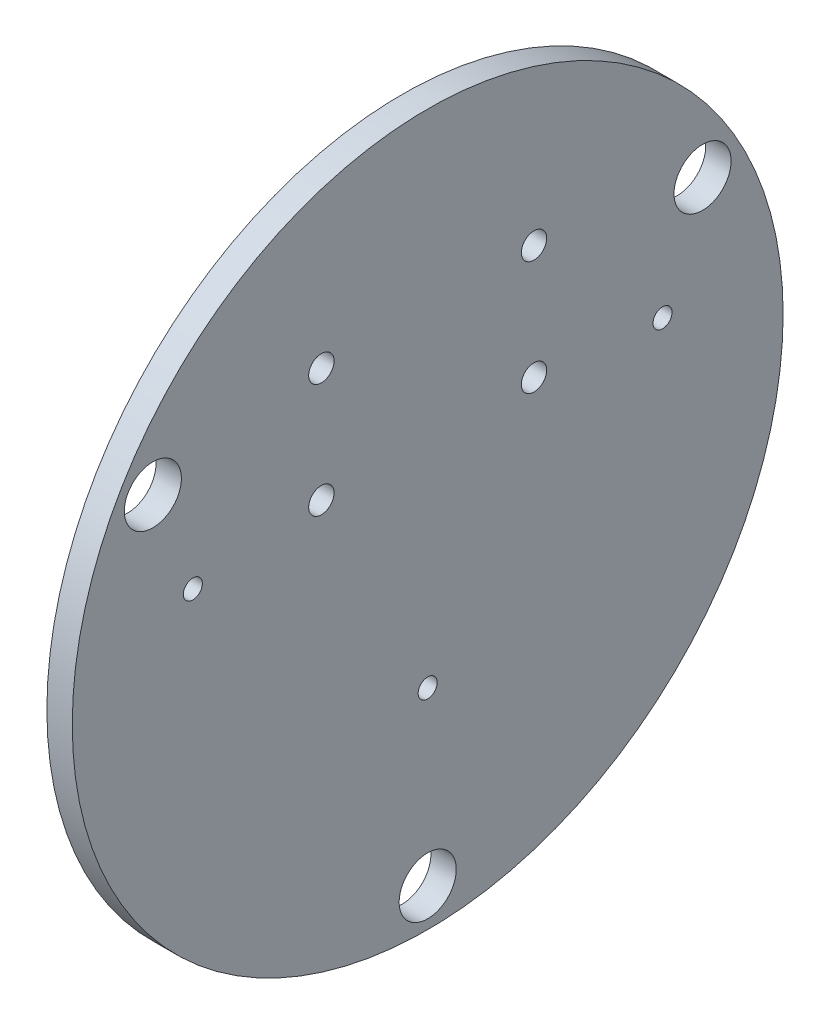
ISO-10303-21;
HEADER;
FILE_DESCRIPTION(('STEP AP214'),'2;1');
FILE_NAME('part.step','',(''),(''),'','','');
FILE_SCHEMA(('AUTOMOTIVE_DESIGN { 1 0 10303 214 1 1 1 1 }'));
ENDSEC;
DATA;
#1=APPLICATION_CONTEXT('core data for automotive mechanical design processes');
#2=APPLICATION_PROTOCOL_DEFINITION('international standard','automotive_design',2000,#1);
#3=PRODUCT_CONTEXT('',#1,'mechanical');
#4=PRODUCT('Part','Part','',(#3));
#5=PRODUCT_RELATED_PRODUCT_CATEGORY('part','',(#4));
#6=PRODUCT_DEFINITION_FORMATION('','',#4);
#7=PRODUCT_DEFINITION_CONTEXT('part definition',#1,'design');
#8=PRODUCT_DEFINITION('design','',#6,#7);
#9=PRODUCT_DEFINITION_SHAPE('','',#8);
#10=(LENGTH_UNIT() NAMED_UNIT(*) SI_UNIT(.MILLI.,.METRE.));
#11=(NAMED_UNIT(*) PLANE_ANGLE_UNIT() SI_UNIT($,.RADIAN.));
#12=(NAMED_UNIT(*) SI_UNIT($,.STERADIAN.) SOLID_ANGLE_UNIT());
#13=UNCERTAINTY_MEASURE_WITH_UNIT(LENGTH_MEASURE(1.E-05),#10,'distance_accuracy_value','');
#14=(GEOMETRIC_REPRESENTATION_CONTEXT(3) GLOBAL_UNCERTAINTY_ASSIGNED_CONTEXT((#13)) GLOBAL_UNIT_ASSIGNED_CONTEXT((#10,
#11,#12)) REPRESENTATION_CONTEXT('',''));
#15=CARTESIAN_POINT('',(0.,0.,0.));
#16=DIRECTION('',(0.,0.,1.));
#17=DIRECTION('',(1.,0.,0.));
#18=AXIS2_PLACEMENT_3D('',#15,#16,#17);
#19=CARTESIAN_POINT('',(4.,0.,0.));
#20=DIRECTION('',(-1.,0.,0.));
#21=DIRECTION('',(0.,0.,1.));
#22=AXIS2_PLACEMENT_3D('',#19,#20,#21);
#23=CYLINDRICAL_SURFACE('',#22,56.);
#24=CARTESIAN_POINT('',(4.,0.,0.));
#25=DIRECTION('',(1.,0.,0.));
#26=DIRECTION('',(0.,0.,-1.));
#27=AXIS2_PLACEMENT_3D('',#24,#25,#26);
#28=CIRCLE('',#27,56.);
#29=CARTESIAN_POINT('',(4.,0.,-56.));
#30=VERTEX_POINT('',#29);
#31=EDGE_CURVE('E10',#30,#30,#28,.T.);
#32=ORIENTED_EDGE('',*,*,#31,.F.);
#33=EDGE_LOOP('',(#32));
#34=FACE_BOUND('',#33,.T.);
#35=CARTESIAN_POINT('',(0.,0.,0.));
#36=DIRECTION('',(1.,0.,0.));
#37=DIRECTION('',(0.,0.,-1.));
#38=AXIS2_PLACEMENT_3D('',#35,#36,#37);
#39=CIRCLE('',#38,56.);
#40=CARTESIAN_POINT('',(0.,0.,-56.));
#41=VERTEX_POINT('',#40);
#42=EDGE_CURVE('E33',#41,#41,#39,.T.);
#43=ORIENTED_EDGE('',*,*,#42,.T.);
#44=EDGE_LOOP('',(#43));
#45=FACE_BOUND('',#44,.T.);
#46=ADVANCED_FACE('F30',(#34,#45),#23,.T.);
#47=CARTESIAN_POINT('',(4.,0.,0.));
#48=DIRECTION('',(1.,0.,0.));
#49=DIRECTION('',(0.,0.,-1.));
#50=AXIS2_PLACEMENT_3D('',#47,#48,#49);
#51=PLANE('',#50);
#52=CARTESIAN_POINT('',(4.,9.,-37.));
#53=DIRECTION('',(1.,0.,0.));
#54=DIRECTION('',(0.,0.,-1.));
#55=AXIS2_PLACEMENT_3D('',#52,#53,#54);
#56=CIRCLE('',#55,1.5);
#57=CARTESIAN_POINT('',(4.,9.,-38.5));
#58=VERTEX_POINT('',#57);
#59=EDGE_CURVE('E84',#58,#58,#56,.T.);
#60=ORIENTED_EDGE('',*,*,#59,.F.);
#61=EDGE_LOOP('',(#60));
#62=FACE_BOUND('',#61,.T.);
#63=CARTESIAN_POINT('',(4.,-23.,0.));
#64=DIRECTION('',(1.,0.,0.));
#65=DIRECTION('',(0.,0.,-1.));
#66=AXIS2_PLACEMENT_3D('',#63,#64,#65);
#67=CIRCLE('',#66,1.5);
#68=CARTESIAN_POINT('',(4.,-23.,-1.50000000000001));
#69=VERTEX_POINT('',#68);
#70=EDGE_CURVE('E90',#69,#69,#67,.T.);
#71=ORIENTED_EDGE('',*,*,#70,.F.);
#72=EDGE_LOOP('',(#71));
#73=FACE_BOUND('',#72,.T.);
#74=CARTESIAN_POINT('',(4.,9.,37.));
#75=DIRECTION('',(1.,0.,0.));
#76=DIRECTION('',(0.,0.,-1.));
#77=AXIS2_PLACEMENT_3D('',#74,#75,#76);
#78=CIRCLE('',#77,1.50000000000002);
#79=CARTESIAN_POINT('',(4.,9.,35.5));
#80=VERTEX_POINT('',#79);
#81=EDGE_CURVE('E96',#80,#80,#78,.T.);
#82=ORIENTED_EDGE('',*,*,#81,.F.);
#83=EDGE_LOOP('',(#82));
#84=FACE_BOUND('',#83,.T.);
#85=CARTESIAN_POINT('',(4.,11.,16.75));
#86=DIRECTION('',(1.,0.,0.));
#87=DIRECTION('',(0.,0.,-1.));
#88=AXIS2_PLACEMENT_3D('',#85,#86,#87);
#89=CIRCLE('',#88,2.);
#90=CARTESIAN_POINT('',(4.,11.,14.75));
#91=VERTEX_POINT('',#90);
#92=EDGE_CURVE('E66',#91,#91,#89,.T.);
#93=ORIENTED_EDGE('',*,*,#92,.F.);
#94=EDGE_LOOP('',(#93));
#95=FACE_BOUND('',#94,.T.);
#96=CARTESIAN_POINT('',(4.,11.,-16.75));
#97=DIRECTION('',(1.,0.,0.));
#98=DIRECTION('',(0.,0.,-1.));
#99=AXIS2_PLACEMENT_3D('',#96,#97,#98);
#100=CIRCLE('',#99,2.);
#101=CARTESIAN_POINT('',(4.,11.,-18.75));
#102=VERTEX_POINT('',#101);
#103=EDGE_CURVE('E73',#102,#102,#100,.T.);
#104=ORIENTED_EDGE('',*,*,#103,.F.);
#105=EDGE_LOOP('',(#104));
#106=FACE_BOUND('',#105,.T.);
#107=CARTESIAN_POINT('',(4.,28.9954942187123,-16.75));
#108=DIRECTION('',(1.,0.,0.));
#109=DIRECTION('',(0.,0.,-1.));
#110=AXIS2_PLACEMENT_3D('',#107,#108,#109);
#111=CIRCLE('',#110,2.);
#112=CARTESIAN_POINT('',(4.,28.9954942187123,-18.75));
#113=VERTEX_POINT('',#112);
#114=EDGE_CURVE('E79',#113,#113,#111,.T.);
#115=ORIENTED_EDGE('',*,*,#114,.F.);
#116=EDGE_LOOP('',(#115));
#117=FACE_BOUND('',#116,.T.);
#118=CARTESIAN_POINT('',(4.,28.9954942187123,16.75));
#119=DIRECTION('',(1.,0.,0.));
#120=DIRECTION('',(0.,0.,-1.));
#121=AXIS2_PLACEMENT_3D('',#118,#119,#120);
#122=CIRCLE('',#121,2.);
#123=CARTESIAN_POINT('',(4.,28.9954942187123,14.75));
#124=VERTEX_POINT('',#123);
#125=EDGE_CURVE('E60',#124,#124,#122,.T.);
#126=ORIENTED_EDGE('',*,*,#125,.F.);
#127=EDGE_LOOP('',(#126));
#128=FACE_BOUND('',#127,.T.);
#129=CARTESIAN_POINT('',(4.,25.,43.3012701892219));
#130=DIRECTION('',(-1.,0.,0.));
#131=DIRECTION('',(0.,0.,1.));
#132=AXIS2_PLACEMENT_3D('',#129,#130,#131);
#133=CIRCLE('',#132,4.5);
#134=CARTESIAN_POINT('',(4.,25.,47.8012701892219));
#135=VERTEX_POINT('',#134);
#136=EDGE_CURVE('E45',#135,#135,#133,.T.);
#137=ORIENTED_EDGE('',*,*,#136,.T.);
#138=EDGE_LOOP('',(#137));
#139=FACE_BOUND('',#138,.T.);
#140=CARTESIAN_POINT('',(4.,-50.,0.));
#141=DIRECTION('',(-1.,0.,0.));
#142=DIRECTION('',(0.,0.,1.));
#143=AXIS2_PLACEMENT_3D('',#140,#141,#142);
#144=CIRCLE('',#143,4.5);
#145=CARTESIAN_POINT('',(4.,-50.,4.5));
#146=VERTEX_POINT('',#145);
#147=EDGE_CURVE('E51',#146,#146,#144,.T.);
#148=ORIENTED_EDGE('',*,*,#147,.T.);
#149=EDGE_LOOP('',(#148));
#150=FACE_BOUND('',#149,.T.);
#151=CARTESIAN_POINT('',(4.,25.,-43.3012701892219));
#152=DIRECTION('',(-1.,0.,0.));
#153=DIRECTION('',(0.,0.,1.));
#154=AXIS2_PLACEMENT_3D('',#151,#152,#153);
#155=CIRCLE('',#154,4.5);
#156=CARTESIAN_POINT('',(4.,25.,-38.8012701892219));
#157=VERTEX_POINT('',#156);
#158=EDGE_CURVE('E40',#157,#157,#155,.T.);
#159=ORIENTED_EDGE('',*,*,#158,.T.);
#160=EDGE_LOOP('',(#159));
#161=FACE_BOUND('',#160,.T.);
#162=ORIENTED_EDGE('',*,*,#31,.T.);
#163=EDGE_LOOP('',(#162));
#164=FACE_BOUND('',#163,.T.);
#165=ADVANCED_FACE('F113',(#62,#73,#84,#95,#106,#117,#128,#139,#150,#161,#164),#51,.T.);
#166=CARTESIAN_POINT('',(0.,0.,0.));
#167=DIRECTION('',(1.,0.,0.));
#168=DIRECTION('',(0.,0.,-1.));
#169=AXIS2_PLACEMENT_3D('',#166,#167,#168);
#170=PLANE('',#169);
#171=CARTESIAN_POINT('',(0.,9.,-37.));
#172=DIRECTION('',(1.,0.,0.));
#173=DIRECTION('',(0.,0.,-1.));
#174=AXIS2_PLACEMENT_3D('',#171,#172,#173);
#175=CIRCLE('',#174,1.5);
#176=CARTESIAN_POINT('',(0.,9.,-38.5));
#177=VERTEX_POINT('',#176);
#178=EDGE_CURVE('E87',#177,#177,#175,.T.);
#179=ORIENTED_EDGE('',*,*,#178,.T.);
#180=EDGE_LOOP('',(#179));
#181=FACE_BOUND('',#180,.T.);
#182=CARTESIAN_POINT('',(0.,-23.,0.));
#183=DIRECTION('',(1.,0.,0.));
#184=DIRECTION('',(0.,0.,-1.));
#185=AXIS2_PLACEMENT_3D('',#182,#183,#184);
#186=CIRCLE('',#185,1.5);
#187=CARTESIAN_POINT('',(0.,-23.,-1.50000000000001));
#188=VERTEX_POINT('',#187);
#189=EDGE_CURVE('E93',#188,#188,#186,.T.);
#190=ORIENTED_EDGE('',*,*,#189,.T.);
#191=EDGE_LOOP('',(#190));
#192=FACE_BOUND('',#191,.T.);
#193=CARTESIAN_POINT('',(0.,9.,37.));
#194=DIRECTION('',(1.,0.,0.));
#195=DIRECTION('',(0.,0.,-1.));
#196=AXIS2_PLACEMENT_3D('',#193,#194,#195);
#197=CIRCLE('',#196,1.50000000000002);
#198=CARTESIAN_POINT('',(0.,9.,35.5));
#199=VERTEX_POINT('',#198);
#200=EDGE_CURVE('E70',#199,#199,#197,.T.);
#201=ORIENTED_EDGE('',*,*,#200,.T.);
#202=EDGE_LOOP('',(#201));
#203=FACE_BOUND('',#202,.T.);
#204=CARTESIAN_POINT('',(0.,11.,16.75));
#205=DIRECTION('',(1.,0.,0.));
#206=DIRECTION('',(0.,0.,-1.));
#207=AXIS2_PLACEMENT_3D('',#204,#205,#206);
#208=CIRCLE('',#207,2.);
#209=CARTESIAN_POINT('',(0.,11.,14.75));
#210=VERTEX_POINT('',#209);
#211=EDGE_CURVE('E69',#210,#210,#208,.T.);
#212=ORIENTED_EDGE('',*,*,#211,.T.);
#213=EDGE_LOOP('',(#212));
#214=FACE_BOUND('',#213,.T.);
#215=CARTESIAN_POINT('',(0.,11.,-16.75));
#216=DIRECTION('',(1.,0.,0.));
#217=DIRECTION('',(0.,0.,-1.));
#218=AXIS2_PLACEMENT_3D('',#215,#216,#217);
#219=CIRCLE('',#218,2.);
#220=CARTESIAN_POINT('',(0.,11.,-18.75));
#221=VERTEX_POINT('',#220);
#222=EDGE_CURVE('E76',#221,#221,#219,.T.);
#223=ORIENTED_EDGE('',*,*,#222,.T.);
#224=EDGE_LOOP('',(#223));
#225=FACE_BOUND('',#224,.T.);
#226=CARTESIAN_POINT('',(0.,28.9954942187123,-16.75));
#227=DIRECTION('',(1.,0.,0.));
#228=DIRECTION('',(0.,0.,-1.));
#229=AXIS2_PLACEMENT_3D('',#226,#227,#228);
#230=CIRCLE('',#229,2.);
#231=CARTESIAN_POINT('',(0.,28.9954942187123,-18.75));
#232=VERTEX_POINT('',#231);
#233=EDGE_CURVE('E63',#232,#232,#230,.T.);
#234=ORIENTED_EDGE('',*,*,#233,.T.);
#235=EDGE_LOOP('',(#234));
#236=FACE_BOUND('',#235,.T.);
#237=CARTESIAN_POINT('',(0.,28.9954942187123,16.75));
#238=DIRECTION('',(1.,0.,0.));
#239=DIRECTION('',(0.,0.,-1.));
#240=AXIS2_PLACEMENT_3D('',#237,#238,#239);
#241=CIRCLE('',#240,2.);
#242=CARTESIAN_POINT('',(0.,28.9954942187123,14.75));
#243=VERTEX_POINT('',#242);
#244=EDGE_CURVE('E52',#243,#243,#241,.T.);
#245=ORIENTED_EDGE('',*,*,#244,.T.);
#246=EDGE_LOOP('',(#245));
#247=FACE_BOUND('',#246,.T.);
#248=CARTESIAN_POINT('',(0.,25.,43.3012701892219));
#249=DIRECTION('',(-1.,0.,0.));
#250=DIRECTION('',(0.,0.,1.));
#251=AXIS2_PLACEMENT_3D('',#248,#249,#250);
#252=CIRCLE('',#251,4.5);
#253=CARTESIAN_POINT('',(0.,25.,47.8012701892219));
#254=VERTEX_POINT('',#253);
#255=EDGE_CURVE('E55',#254,#254,#252,.T.);
#256=ORIENTED_EDGE('',*,*,#255,.F.);
#257=EDGE_LOOP('',(#256));
#258=FACE_BOUND('',#257,.T.);
#259=CARTESIAN_POINT('',(0.,-50.,0.));
#260=DIRECTION('',(-1.,0.,0.));
#261=DIRECTION('',(0.,0.,1.));
#262=AXIS2_PLACEMENT_3D('',#259,#260,#261);
#263=CIRCLE('',#262,4.5);
#264=CARTESIAN_POINT('',(0.,-50.,4.5));
#265=VERTEX_POINT('',#264);
#266=EDGE_CURVE('E48',#265,#265,#263,.T.);
#267=ORIENTED_EDGE('',*,*,#266,.F.);
#268=EDGE_LOOP('',(#267));
#269=FACE_BOUND('',#268,.T.);
#270=CARTESIAN_POINT('',(0.,25.,-43.3012701892219));
#271=DIRECTION('',(-1.,0.,0.));
#272=DIRECTION('',(0.,0.,1.));
#273=AXIS2_PLACEMENT_3D('',#270,#271,#272);
#274=CIRCLE('',#273,4.5);
#275=CARTESIAN_POINT('',(0.,25.,-38.8012701892219));
#276=VERTEX_POINT('',#275);
#277=EDGE_CURVE('E42',#276,#276,#274,.T.);
#278=ORIENTED_EDGE('',*,*,#277,.F.);
#279=EDGE_LOOP('',(#278));
#280=FACE_BOUND('',#279,.T.);
#281=ORIENTED_EDGE('',*,*,#42,.F.);
#282=EDGE_LOOP('',(#281));
#283=FACE_BOUND('',#282,.T.);
#284=ADVANCED_FACE('F102',(#181,#192,#203,#214,#225,#236,#247,#258,#269,#280,#283),#170,.F.);
#285=CARTESIAN_POINT('',(4.,25.,-43.3012701892219));
#286=DIRECTION('',(-1.,0.,0.));
#287=DIRECTION('',(0.,0.,1.));
#288=AXIS2_PLACEMENT_3D('',#285,#286,#287);
#289=CYLINDRICAL_SURFACE('',#288,4.5);
#290=ORIENTED_EDGE('',*,*,#158,.F.);
#291=EDGE_LOOP('',(#290));
#292=FACE_BOUND('',#291,.T.);
#293=ORIENTED_EDGE('',*,*,#277,.T.);
#294=EDGE_LOOP('',(#293));
#295=FACE_BOUND('',#294,.T.);
#296=ADVANCED_FACE('F132',(#292,#295),#289,.F.);
#297=CARTESIAN_POINT('',(4.,-50.,0.));
#298=DIRECTION('',(-1.,0.,0.));
#299=DIRECTION('',(0.,0.,1.));
#300=AXIS2_PLACEMENT_3D('',#297,#298,#299);
#301=CYLINDRICAL_SURFACE('',#300,4.5);
#302=ORIENTED_EDGE('',*,*,#147,.F.);
#303=EDGE_LOOP('',(#302));
#304=FACE_BOUND('',#303,.T.);
#305=ORIENTED_EDGE('',*,*,#266,.T.);
#306=EDGE_LOOP('',(#305));
#307=FACE_BOUND('',#306,.T.);
#308=ADVANCED_FACE('F135',(#304,#307),#301,.F.);
#309=CARTESIAN_POINT('',(4.,25.,43.3012701892219));
#310=DIRECTION('',(-1.,0.,0.));
#311=DIRECTION('',(0.,0.,1.));
#312=AXIS2_PLACEMENT_3D('',#309,#310,#311);
#313=CYLINDRICAL_SURFACE('',#312,4.5);
#314=ORIENTED_EDGE('',*,*,#136,.F.);
#315=EDGE_LOOP('',(#314));
#316=FACE_BOUND('',#315,.T.);
#317=ORIENTED_EDGE('',*,*,#255,.T.);
#318=EDGE_LOOP('',(#317));
#319=FACE_BOUND('',#318,.T.);
#320=ADVANCED_FACE('F168',(#316,#319),#313,.F.);
#321=CARTESIAN_POINT('',(0.,28.9954942187123,16.75));
#322=DIRECTION('',(1.,0.,0.));
#323=DIRECTION('',(0.,0.,-1.));
#324=AXIS2_PLACEMENT_3D('',#321,#322,#323);
#325=CYLINDRICAL_SURFACE('',#324,2.);
#326=ORIENTED_EDGE('',*,*,#244,.F.);
#327=EDGE_LOOP('',(#326));
#328=FACE_BOUND('',#327,.T.);
#329=ORIENTED_EDGE('',*,*,#125,.T.);
#330=EDGE_LOOP('',(#329));
#331=FACE_BOUND('',#330,.T.);
#332=ADVANCED_FACE('F175',(#328,#331),#325,.F.);
#333=CARTESIAN_POINT('',(0.,28.9954942187123,-16.75));
#334=DIRECTION('',(1.,0.,0.));
#335=DIRECTION('',(0.,0.,-1.));
#336=AXIS2_PLACEMENT_3D('',#333,#334,#335);
#337=CYLINDRICAL_SURFACE('',#336,2.);
#338=ORIENTED_EDGE('',*,*,#233,.F.);
#339=EDGE_LOOP('',(#338));
#340=FACE_BOUND('',#339,.T.);
#341=ORIENTED_EDGE('',*,*,#114,.T.);
#342=EDGE_LOOP('',(#341));
#343=FACE_BOUND('',#342,.T.);
#344=ADVANCED_FACE('F182',(#340,#343),#337,.F.);
#345=CARTESIAN_POINT('',(0.,11.,-16.75));
#346=DIRECTION('',(1.,0.,0.));
#347=DIRECTION('',(0.,0.,-1.));
#348=AXIS2_PLACEMENT_3D('',#345,#346,#347);
#349=CYLINDRICAL_SURFACE('',#348,2.);
#350=ORIENTED_EDGE('',*,*,#222,.F.);
#351=EDGE_LOOP('',(#350));
#352=FACE_BOUND('',#351,.T.);
#353=ORIENTED_EDGE('',*,*,#103,.T.);
#354=EDGE_LOOP('',(#353));
#355=FACE_BOUND('',#354,.T.);
#356=ADVANCED_FACE('F190',(#352,#355),#349,.F.);
#357=CARTESIAN_POINT('',(0.,11.,16.75));
#358=DIRECTION('',(1.,0.,0.));
#359=DIRECTION('',(0.,0.,-1.));
#360=AXIS2_PLACEMENT_3D('',#357,#358,#359);
#361=CYLINDRICAL_SURFACE('',#360,2.);
#362=ORIENTED_EDGE('',*,*,#211,.F.);
#363=EDGE_LOOP('',(#362));
#364=FACE_BOUND('',#363,.T.);
#365=ORIENTED_EDGE('',*,*,#92,.T.);
#366=EDGE_LOOP('',(#365));
#367=FACE_BOUND('',#366,.T.);
#368=ADVANCED_FACE('F109',(#364,#367),#361,.F.);
#369=CARTESIAN_POINT('',(0.,9.,37.));
#370=DIRECTION('',(1.,0.,0.));
#371=DIRECTION('',(0.,0.,-1.));
#372=AXIS2_PLACEMENT_3D('',#369,#370,#371);
#373=CYLINDRICAL_SURFACE('',#372,1.50000000000002);
#374=ORIENTED_EDGE('',*,*,#200,.F.);
#375=EDGE_LOOP('',(#374));
#376=FACE_BOUND('',#375,.T.);
#377=ORIENTED_EDGE('',*,*,#81,.T.);
#378=EDGE_LOOP('',(#377));
#379=FACE_BOUND('',#378,.T.);
#380=ADVANCED_FACE('F105',(#376,#379),#373,.F.);
#381=CARTESIAN_POINT('',(0.,-23.,0.));
#382=DIRECTION('',(1.,0.,0.));
#383=DIRECTION('',(0.,0.,-1.));
#384=AXIS2_PLACEMENT_3D('',#381,#382,#383);
#385=CYLINDRICAL_SURFACE('',#384,1.5);
#386=ORIENTED_EDGE('',*,*,#189,.F.);
#387=EDGE_LOOP('',(#386));
#388=FACE_BOUND('',#387,.T.);
#389=ORIENTED_EDGE('',*,*,#70,.T.);
#390=EDGE_LOOP('',(#389));
#391=FACE_BOUND('',#390,.T.);
#392=ADVANCED_FACE('F108',(#388,#391),#385,.F.);
#393=CARTESIAN_POINT('',(0.,9.,-37.));
#394=DIRECTION('',(1.,0.,0.));
#395=DIRECTION('',(0.,0.,-1.));
#396=AXIS2_PLACEMENT_3D('',#393,#394,#395);
#397=CYLINDRICAL_SURFACE('',#396,1.5);
#398=ORIENTED_EDGE('',*,*,#178,.F.);
#399=EDGE_LOOP('',(#398));
#400=FACE_BOUND('',#399,.T.);
#401=ORIENTED_EDGE('',*,*,#59,.T.);
#402=EDGE_LOOP('',(#401));
#403=FACE_BOUND('',#402,.T.);
#404=ADVANCED_FACE('F216',(#400,#403),#397,.F.);
#405=CLOSED_SHELL('',(#46,#165,#284,#296,#308,#320,#332,#344,#356,#368,#380,#392,#404));
#406=MANIFOLD_SOLID_BREP('B2',#405);
#407=ADVANCED_BREP_SHAPE_REPRESENTATION('',(#18,#406),#14);
#408=SHAPE_DEFINITION_REPRESENTATION(#9,#407);
ENDSEC;
END-ISO-10303-21;
